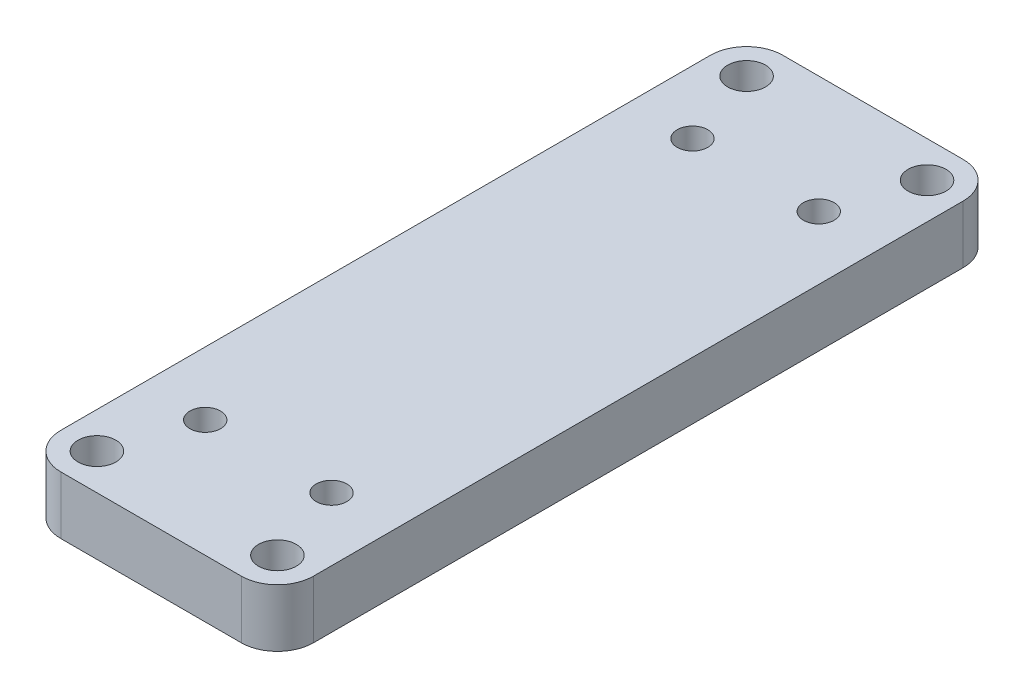
ISO-10303-21;
HEADER;
FILE_DESCRIPTION(('STEP AP214'),'2;1');
FILE_NAME('part.step','',(''),(''),'','','');
FILE_SCHEMA(('AUTOMOTIVE_DESIGN { 1 0 10303 214 1 1 1 1 }'));
ENDSEC;
DATA;
#1=APPLICATION_CONTEXT('core data for automotive mechanical design processes');
#2=APPLICATION_PROTOCOL_DEFINITION('international standard','automotive_design',2000,#1);
#3=PRODUCT_CONTEXT('',#1,'mechanical');
#4=PRODUCT('Part','Part','',(#3));
#5=PRODUCT_RELATED_PRODUCT_CATEGORY('part','',(#4));
#6=PRODUCT_DEFINITION_FORMATION('','',#4);
#7=PRODUCT_DEFINITION_CONTEXT('part definition',#1,'design');
#8=PRODUCT_DEFINITION('design','',#6,#7);
#9=PRODUCT_DEFINITION_SHAPE('','',#8);
#10=(LENGTH_UNIT() NAMED_UNIT(*) SI_UNIT(.MILLI.,.METRE.));
#11=(NAMED_UNIT(*) PLANE_ANGLE_UNIT() SI_UNIT($,.RADIAN.));
#12=(NAMED_UNIT(*) SI_UNIT($,.STERADIAN.) SOLID_ANGLE_UNIT());
#13=UNCERTAINTY_MEASURE_WITH_UNIT(LENGTH_MEASURE(1.E-05),#10,'distance_accuracy_value','');
#14=(GEOMETRIC_REPRESENTATION_CONTEXT(3) GLOBAL_UNCERTAINTY_ASSIGNED_CONTEXT((#13)) GLOBAL_UNIT_ASSIGNED_CONTEXT((#10,
#11,#12)) REPRESENTATION_CONTEXT('',''));
#15=CARTESIAN_POINT('',(0.,0.,0.));
#16=DIRECTION('',(0.,0.,1.));
#17=DIRECTION('',(1.,0.,0.));
#18=AXIS2_PLACEMENT_3D('',#15,#16,#17);
#19=CARTESIAN_POINT('',(-35.,16.,100.));
#20=DIRECTION('',(0.,1.,0.));
#21=DIRECTION('',(1.,0.,0.));
#22=AXIS2_PLACEMENT_3D('',#19,#20,#21);
#23=PLANE('',#22);
#24=CARTESIAN_POINT('',(-52.5,16.,167.5));
#25=DIRECTION('',(0.,-1.,0.));
#26=DIRECTION('',(1.,0.,0.));
#27=AXIS2_PLACEMENT_3D('',#24,#25,#26);
#28=CIRCLE('',#27,4.25);
#29=CARTESIAN_POINT('',(-56.75,16.,167.5));
#30=VERTEX_POINT('',#29);
#31=EDGE_CURVE('E40',#30,#30,#28,.T.);
#32=ORIENTED_EDGE('',*,*,#31,.T.);
#33=EDGE_LOOP('',(#32));
#34=FACE_BOUND('',#33,.T.);
#35=CARTESIAN_POINT('',(-52.5,16.,32.5));
#36=DIRECTION('',(0.,-1.,0.));
#37=DIRECTION('',(1.,0.,0.));
#38=AXIS2_PLACEMENT_3D('',#35,#36,#37);
#39=CIRCLE('',#38,4.25);
#40=CARTESIAN_POINT('',(-56.75,16.,32.5));
#41=VERTEX_POINT('',#40);
#42=EDGE_CURVE('E232',#41,#41,#39,.T.);
#43=ORIENTED_EDGE('',*,*,#42,.T.);
#44=EDGE_LOOP('',(#43));
#45=FACE_BOUND('',#44,.T.);
#46=CARTESIAN_POINT('',(-17.5,16.,32.5));
#47=DIRECTION('',(0.,-1.,0.));
#48=DIRECTION('',(1.,0.,0.));
#49=AXIS2_PLACEMENT_3D('',#46,#47,#48);
#50=CIRCLE('',#49,4.25);
#51=CARTESIAN_POINT('',(-21.75,16.,32.5));
#52=VERTEX_POINT('',#51);
#53=EDGE_CURVE('E259',#52,#52,#50,.T.);
#54=ORIENTED_EDGE('',*,*,#53,.T.);
#55=EDGE_LOOP('',(#54));
#56=FACE_BOUND('',#55,.T.);
#57=CARTESIAN_POINT('',(-17.5,16.,167.5));
#58=DIRECTION('',(0.,-1.,0.));
#59=DIRECTION('',(1.,0.,0.));
#60=AXIS2_PLACEMENT_3D('',#57,#58,#59);
#61=CIRCLE('',#60,4.25);
#62=CARTESIAN_POINT('',(-21.75,16.,167.5));
#63=VERTEX_POINT('',#62);
#64=EDGE_CURVE('E267',#63,#63,#61,.T.);
#65=ORIENTED_EDGE('',*,*,#64,.T.);
#66=EDGE_LOOP('',(#65));
#67=FACE_BOUND('',#66,.T.);
#68=CARTESIAN_POINT('',(-10.,16.,190.));
#69=DIRECTION('',(0.,-1.,0.));
#70=DIRECTION('',(1.,0.,0.));
#71=AXIS2_PLACEMENT_3D('',#68,#69,#70);
#72=CIRCLE('',#71,5.25);
#73=CARTESIAN_POINT('',(-15.25,16.,190.));
#74=VERTEX_POINT('',#73);
#75=EDGE_CURVE('E223',#74,#74,#72,.T.);
#76=ORIENTED_EDGE('',*,*,#75,.T.);
#77=EDGE_LOOP('',(#76));
#78=FACE_BOUND('',#77,.T.);
#79=CARTESIAN_POINT('',(-10.,16.,10.));
#80=DIRECTION('',(0.,-1.,0.));
#81=DIRECTION('',(1.,0.,0.));
#82=AXIS2_PLACEMENT_3D('',#79,#80,#81);
#83=CIRCLE('',#82,5.25);
#84=CARTESIAN_POINT('',(-15.25,16.,10.));
#85=VERTEX_POINT('',#84);
#86=EDGE_CURVE('E224',#85,#85,#83,.T.);
#87=ORIENTED_EDGE('',*,*,#86,.T.);
#88=EDGE_LOOP('',(#87));
#89=FACE_BOUND('',#88,.T.);
#90=CARTESIAN_POINT('',(-60.,16.,10.));
#91=DIRECTION('',(0.,-1.,0.));
#92=DIRECTION('',(1.,0.,0.));
#93=AXIS2_PLACEMENT_3D('',#90,#91,#92);
#94=CIRCLE('',#93,5.25);
#95=CARTESIAN_POINT('',(-65.25,16.,10.));
#96=VERTEX_POINT('',#95);
#97=EDGE_CURVE('E240',#96,#96,#94,.T.);
#98=ORIENTED_EDGE('',*,*,#97,.T.);
#99=EDGE_LOOP('',(#98));
#100=FACE_BOUND('',#99,.T.);
#101=CARTESIAN_POINT('',(-60.,16.,190.));
#102=DIRECTION('',(0.,-1.,0.));
#103=DIRECTION('',(1.,0.,0.));
#104=AXIS2_PLACEMENT_3D('',#101,#102,#103);
#105=CIRCLE('',#104,5.25);
#106=CARTESIAN_POINT('',(-65.25,16.,190.));
#107=VERTEX_POINT('',#106);
#108=EDGE_CURVE('E211',#107,#107,#105,.T.);
#109=ORIENTED_EDGE('',*,*,#108,.T.);
#110=EDGE_LOOP('',(#109));
#111=FACE_BOUND('',#110,.T.);
#112=CARTESIAN_POINT('',(-60.,16.,10.));
#113=DIRECTION('',(0.,-1.,0.));
#114=DIRECTION('',(-0.707106781186548,0.,-0.707106781186547));
#115=AXIS2_PLACEMENT_3D('',#112,#113,#114);
#116=CIRCLE('',#115,10.);
#117=CARTESIAN_POINT('',(-70.,16.,10.));
#118=VERTEX_POINT('',#117);
#119=CARTESIAN_POINT('',(-60.,16.,0.));
#120=VERTEX_POINT('',#119);
#121=EDGE_CURVE('E190',#118,#120,#116,.T.);
#122=ORIENTED_EDGE('',*,*,#121,.F.);
#123=DIRECTION('',(0.,0.,1.));
#124=VECTOR('',#123,1.);
#125=CARTESIAN_POINT('',(-70.,16.,0.));
#126=LINE('',#125,#124);
#127=CARTESIAN_POINT('',(-70.,16.,190.));
#128=VERTEX_POINT('',#127);
#129=EDGE_CURVE('E175',#118,#128,#126,.T.);
#130=ORIENTED_EDGE('',*,*,#129,.T.);
#131=CARTESIAN_POINT('',(-60.,16.,190.));
#132=DIRECTION('',(0.,-1.,0.));
#133=DIRECTION('',(-0.707106781186548,0.,0.707106781186548));
#134=AXIS2_PLACEMENT_3D('',#131,#132,#133);
#135=CIRCLE('',#134,10.);
#136=CARTESIAN_POINT('',(-60.,16.,200.));
#137=VERTEX_POINT('',#136);
#138=EDGE_CURVE('E199',#137,#128,#135,.T.);
#139=ORIENTED_EDGE('',*,*,#138,.F.);
#140=DIRECTION('',(1.,0.,0.));
#141=VECTOR('',#140,1.);
#142=CARTESIAN_POINT('',(-70.,16.,200.));
#143=LINE('',#142,#141);
#144=CARTESIAN_POINT('',(-10.,16.,200.));
#145=VERTEX_POINT('',#144);
#146=EDGE_CURVE('E28',#137,#145,#143,.T.);
#147=ORIENTED_EDGE('',*,*,#146,.T.);
#148=CARTESIAN_POINT('',(-10.,16.,190.));
#149=DIRECTION('',(0.,-1.,0.));
#150=DIRECTION('',(0.707106781186548,0.,0.707106781186547));
#151=AXIS2_PLACEMENT_3D('',#148,#149,#150);
#152=CIRCLE('',#151,10.);
#153=CARTESIAN_POINT('',(0.,16.,190.));
#154=VERTEX_POINT('',#153);
#155=EDGE_CURVE('E200',#154,#145,#152,.T.);
#156=ORIENTED_EDGE('',*,*,#155,.F.);
#157=DIRECTION('',(0.,0.,-1.));
#158=VECTOR('',#157,1.);
#159=CARTESIAN_POINT('',(0.,16.,200.));
#160=LINE('',#159,#158);
#161=CARTESIAN_POINT('',(0.,16.,10.));
#162=VERTEX_POINT('',#161);
#163=EDGE_CURVE('E284',#154,#162,#160,.T.);
#164=ORIENTED_EDGE('',*,*,#163,.T.);
#165=CARTESIAN_POINT('',(-10.,16.,10.));
#166=DIRECTION('',(0.,-1.,0.));
#167=DIRECTION('',(0.707106781186547,0.,-0.707106781186548));
#168=AXIS2_PLACEMENT_3D('',#165,#166,#167);
#169=CIRCLE('',#168,10.);
#170=CARTESIAN_POINT('',(-10.,16.,0.));
#171=VERTEX_POINT('',#170);
#172=EDGE_CURVE('E246',#171,#162,#169,.T.);
#173=ORIENTED_EDGE('',*,*,#172,.F.);
#174=DIRECTION('',(-1.,0.,0.));
#175=VECTOR('',#174,1.);
#176=CARTESIAN_POINT('',(0.,16.,0.));
#177=LINE('',#176,#175);
#178=EDGE_CURVE('E11',#171,#120,#177,.T.);
#179=ORIENTED_EDGE('',*,*,#178,.T.);
#180=EDGE_LOOP('',(#122,#130,#139,#147,#156,#164,#173,#179));
#181=FACE_BOUND('',#180,.T.);
#182=ADVANCED_FACE('F17',(#34,#45,#56,#67,#78,#89,#100,#111,#181),#23,.T.);
#183=CARTESIAN_POINT('',(0.,0.,0.));
#184=DIRECTION('',(0.,0.,-1.));
#185=DIRECTION('',(-1.,0.,0.));
#186=AXIS2_PLACEMENT_3D('',#183,#184,#185);
#187=PLANE('',#186);
#188=DIRECTION('',(0.,-1.,0.));
#189=VECTOR('',#188,1.);
#190=CARTESIAN_POINT('',(-60.,0.,0.));
#191=LINE('',#190,#189);
#192=CARTESIAN_POINT('',(-60.,0.,0.));
#193=VERTEX_POINT('',#192);
#194=EDGE_CURVE('E183',#120,#193,#191,.T.);
#195=ORIENTED_EDGE('',*,*,#194,.F.);
#196=ORIENTED_EDGE('',*,*,#178,.F.);
#197=DIRECTION('',(0.,1.,0.));
#198=VECTOR('',#197,1.);
#199=CARTESIAN_POINT('',(-10.,0.,0.));
#200=LINE('',#199,#198);
#201=CARTESIAN_POINT('',(-10.,0.,0.));
#202=VERTEX_POINT('',#201);
#203=EDGE_CURVE('E288',#202,#171,#200,.T.);
#204=ORIENTED_EDGE('',*,*,#203,.F.);
#205=DIRECTION('',(-1.,0.,0.));
#206=VECTOR('',#205,1.);
#207=CARTESIAN_POINT('',(0.,0.,0.));
#208=LINE('',#207,#206);
#209=EDGE_CURVE('E218',#202,#193,#208,.T.);
#210=ORIENTED_EDGE('',*,*,#209,.T.);
#211=EDGE_LOOP('',(#195,#196,#204,#210));
#212=FACE_BOUND('',#211,.T.);
#213=ADVANCED_FACE('F330',(#212),#187,.T.);
#214=CARTESIAN_POINT('',(-70.,0.,200.));
#215=DIRECTION('',(0.,0.,1.));
#216=DIRECTION('',(1.,0.,0.));
#217=AXIS2_PLACEMENT_3D('',#214,#215,#216);
#218=PLANE('',#217);
#219=DIRECTION('',(0.,-1.,0.));
#220=VECTOR('',#219,1.);
#221=CARTESIAN_POINT('',(-10.,0.,200.));
#222=LINE('',#221,#220);
#223=CARTESIAN_POINT('',(-10.,0.,200.));
#224=VERTEX_POINT('',#223);
#225=EDGE_CURVE('E196',#145,#224,#222,.T.);
#226=ORIENTED_EDGE('',*,*,#225,.F.);
#227=ORIENTED_EDGE('',*,*,#146,.F.);
#228=DIRECTION('',(0.,1.,0.));
#229=VECTOR('',#228,1.);
#230=CARTESIAN_POINT('',(-60.,0.,200.));
#231=LINE('',#230,#229);
#232=CARTESIAN_POINT('',(-60.,0.,200.));
#233=VERTEX_POINT('',#232);
#234=EDGE_CURVE('E212',#233,#137,#231,.T.);
#235=ORIENTED_EDGE('',*,*,#234,.F.);
#236=DIRECTION('',(1.,0.,0.));
#237=VECTOR('',#236,1.);
#238=CARTESIAN_POINT('',(-70.,0.,200.));
#239=LINE('',#238,#237);
#240=EDGE_CURVE('E624',#233,#224,#239,.T.);
#241=ORIENTED_EDGE('',*,*,#240,.T.);
#242=EDGE_LOOP('',(#226,#227,#235,#241));
#243=FACE_BOUND('',#242,.T.);
#244=ADVANCED_FACE('F19',(#243),#218,.T.);
#245=CARTESIAN_POINT('',(-52.5,0.,167.5));
#246=DIRECTION('',(0.,1.,0.));
#247=DIRECTION('',(1.,0.,0.));
#248=AXIS2_PLACEMENT_3D('',#245,#246,#247);
#249=CYLINDRICAL_SURFACE('',#248,4.25);
#250=CARTESIAN_POINT('',(-52.5,0.,167.5));
#251=DIRECTION('',(0.,1.,0.));
#252=DIRECTION('',(1.,0.,0.));
#253=AXIS2_PLACEMENT_3D('',#250,#251,#252);
#254=CIRCLE('',#253,4.25);
#255=CARTESIAN_POINT('',(-56.75,0.,167.5));
#256=VERTEX_POINT('',#255);
#257=EDGE_CURVE('E205',#256,#256,#254,.T.);
#258=ORIENTED_EDGE('',*,*,#257,.F.);
#259=DIRECTION('',(0.,1.,0.));
#260=VECTOR('',#259,1.);
#261=CARTESIAN_POINT('',(-56.75,0.,167.5));
#262=LINE('',#261,#260);
#263=EDGE_CURVE('E21',#256,#30,#262,.T.);
#264=ORIENTED_EDGE('',*,*,#263,.T.);
#265=ORIENTED_EDGE('',*,*,#31,.F.);
#266=ORIENTED_EDGE('',*,*,#263,.F.);
#267=EDGE_LOOP('',(#258,#264,#265,#266));
#268=FACE_BOUND('',#267,.T.);
#269=ADVANCED_FACE('F347',(#268),#249,.F.);
#270=CARTESIAN_POINT('',(-52.5,0.,32.5));
#271=DIRECTION('',(0.,1.,0.));
#272=DIRECTION('',(1.,0.,0.));
#273=AXIS2_PLACEMENT_3D('',#270,#271,#272);
#274=CYLINDRICAL_SURFACE('',#273,4.25);
#275=CARTESIAN_POINT('',(-52.5,0.,32.5));
#276=DIRECTION('',(0.,1.,0.));
#277=DIRECTION('',(1.,0.,0.));
#278=AXIS2_PLACEMENT_3D('',#275,#276,#277);
#279=CIRCLE('',#278,4.25);
#280=CARTESIAN_POINT('',(-56.75,0.,32.5));
#281=VERTEX_POINT('',#280);
#282=EDGE_CURVE('E201',#281,#281,#279,.T.);
#283=ORIENTED_EDGE('',*,*,#282,.F.);
#284=DIRECTION('',(0.,1.,0.));
#285=VECTOR('',#284,1.);
#286=CARTESIAN_POINT('',(-56.75,0.,32.5));
#287=LINE('',#286,#285);
#288=EDGE_CURVE('E235',#281,#41,#287,.T.);
#289=ORIENTED_EDGE('',*,*,#288,.T.);
#290=ORIENTED_EDGE('',*,*,#42,.F.);
#291=ORIENTED_EDGE('',*,*,#288,.F.);
#292=EDGE_LOOP('',(#283,#289,#290,#291));
#293=FACE_BOUND('',#292,.T.);
#294=ADVANCED_FACE('F400',(#293),#274,.F.);
#295=CARTESIAN_POINT('',(-17.5,0.,32.5));
#296=DIRECTION('',(0.,1.,0.));
#297=DIRECTION('',(1.,0.,0.));
#298=AXIS2_PLACEMENT_3D('',#295,#296,#297);
#299=CYLINDRICAL_SURFACE('',#298,4.25);
#300=CARTESIAN_POINT('',(-17.5,0.,32.5));
#301=DIRECTION('',(0.,1.,0.));
#302=DIRECTION('',(1.,0.,0.));
#303=AXIS2_PLACEMENT_3D('',#300,#301,#302);
#304=CIRCLE('',#303,4.25);
#305=CARTESIAN_POINT('',(-21.75,0.,32.5));
#306=VERTEX_POINT('',#305);
#307=EDGE_CURVE('E206',#306,#306,#304,.T.);
#308=ORIENTED_EDGE('',*,*,#307,.F.);
#309=DIRECTION('',(0.,1.,0.));
#310=VECTOR('',#309,1.);
#311=CARTESIAN_POINT('',(-21.75,0.,32.5));
#312=LINE('',#311,#310);
#313=EDGE_CURVE('E270',#306,#52,#312,.T.);
#314=ORIENTED_EDGE('',*,*,#313,.T.);
#315=ORIENTED_EDGE('',*,*,#53,.F.);
#316=ORIENTED_EDGE('',*,*,#313,.F.);
#317=EDGE_LOOP('',(#308,#314,#315,#316));
#318=FACE_BOUND('',#317,.T.);
#319=ADVANCED_FACE('F313',(#318),#299,.F.);
#320=CARTESIAN_POINT('',(-17.5,0.,167.5));
#321=DIRECTION('',(0.,1.,0.));
#322=DIRECTION('',(1.,0.,0.));
#323=AXIS2_PLACEMENT_3D('',#320,#321,#322);
#324=CYLINDRICAL_SURFACE('',#323,4.25);
#325=CARTESIAN_POINT('',(-17.5,0.,167.5));
#326=DIRECTION('',(0.,1.,0.));
#327=DIRECTION('',(1.,0.,0.));
#328=AXIS2_PLACEMENT_3D('',#325,#326,#327);
#329=CIRCLE('',#328,4.25);
#330=CARTESIAN_POINT('',(-21.75,0.,167.5));
#331=VERTEX_POINT('',#330);
#332=EDGE_CURVE('E274',#331,#331,#329,.T.);
#333=ORIENTED_EDGE('',*,*,#332,.F.);
#334=DIRECTION('',(0.,1.,0.));
#335=VECTOR('',#334,1.);
#336=CARTESIAN_POINT('',(-21.75,0.,167.5));
#337=LINE('',#336,#335);
#338=EDGE_CURVE('E227',#331,#63,#337,.T.);
#339=ORIENTED_EDGE('',*,*,#338,.T.);
#340=ORIENTED_EDGE('',*,*,#64,.F.);
#341=ORIENTED_EDGE('',*,*,#338,.F.);
#342=EDGE_LOOP('',(#333,#339,#340,#341));
#343=FACE_BOUND('',#342,.T.);
#344=ADVANCED_FACE('F359',(#343),#324,.F.);
#345=CARTESIAN_POINT('',(-10.,0.,190.));
#346=DIRECTION('',(0.,1.,0.));
#347=DIRECTION('',(1.,0.,0.));
#348=AXIS2_PLACEMENT_3D('',#345,#346,#347);
#349=CYLINDRICAL_SURFACE('',#348,5.25);
#350=CARTESIAN_POINT('',(-10.,0.,190.));
#351=DIRECTION('',(0.,1.,0.));
#352=DIRECTION('',(1.,0.,0.));
#353=AXIS2_PLACEMENT_3D('',#350,#351,#352);
#354=CIRCLE('',#353,5.25);
#355=CARTESIAN_POINT('',(-15.25,0.,190.));
#356=VERTEX_POINT('',#355);
#357=EDGE_CURVE('E278',#356,#356,#354,.T.);
#358=ORIENTED_EDGE('',*,*,#357,.F.);
#359=DIRECTION('',(0.,1.,0.));
#360=VECTOR('',#359,1.);
#361=CARTESIAN_POINT('',(-15.25,0.,190.));
#362=LINE('',#361,#360);
#363=EDGE_CURVE('E219',#356,#74,#362,.T.);
#364=ORIENTED_EDGE('',*,*,#363,.T.);
#365=ORIENTED_EDGE('',*,*,#75,.F.);
#366=ORIENTED_EDGE('',*,*,#363,.F.);
#367=EDGE_LOOP('',(#358,#364,#365,#366));
#368=FACE_BOUND('',#367,.T.);
#369=ADVANCED_FACE('F353',(#368),#349,.F.);
#370=CARTESIAN_POINT('',(-10.,0.,10.));
#371=DIRECTION('',(0.,1.,0.));
#372=DIRECTION('',(1.,0.,0.));
#373=AXIS2_PLACEMENT_3D('',#370,#371,#372);
#374=CYLINDRICAL_SURFACE('',#373,5.25);
#375=CARTESIAN_POINT('',(-10.,0.,10.));
#376=DIRECTION('',(0.,1.,0.));
#377=DIRECTION('',(1.,0.,0.));
#378=AXIS2_PLACEMENT_3D('',#375,#376,#377);
#379=CIRCLE('',#378,5.25);
#380=CARTESIAN_POINT('',(-15.25,0.,10.));
#381=VERTEX_POINT('',#380);
#382=EDGE_CURVE('E193',#381,#381,#379,.T.);
#383=ORIENTED_EDGE('',*,*,#382,.F.);
#384=DIRECTION('',(0.,1.,0.));
#385=VECTOR('',#384,1.);
#386=CARTESIAN_POINT('',(-15.25,0.,10.));
#387=LINE('',#386,#385);
#388=EDGE_CURVE('E236',#381,#85,#387,.T.);
#389=ORIENTED_EDGE('',*,*,#388,.T.);
#390=ORIENTED_EDGE('',*,*,#86,.F.);
#391=ORIENTED_EDGE('',*,*,#388,.F.);
#392=EDGE_LOOP('',(#383,#389,#390,#391));
#393=FACE_BOUND('',#392,.T.);
#394=ADVANCED_FACE('F358',(#393),#374,.F.);
#395=CARTESIAN_POINT('',(-60.,0.,10.));
#396=DIRECTION('',(0.,1.,0.));
#397=DIRECTION('',(1.,0.,0.));
#398=AXIS2_PLACEMENT_3D('',#395,#396,#397);
#399=CYLINDRICAL_SURFACE('',#398,5.25);
#400=CARTESIAN_POINT('',(-60.,0.,10.));
#401=DIRECTION('',(0.,1.,0.));
#402=DIRECTION('',(1.,0.,0.));
#403=AXIS2_PLACEMENT_3D('',#400,#401,#402);
#404=CIRCLE('',#403,5.25);
#405=CARTESIAN_POINT('',(-65.25,0.,10.));
#406=VERTEX_POINT('',#405);
#407=EDGE_CURVE('E266',#406,#406,#404,.T.);
#408=ORIENTED_EDGE('',*,*,#407,.F.);
#409=DIRECTION('',(0.,1.,0.));
#410=VECTOR('',#409,1.);
#411=CARTESIAN_POINT('',(-65.25,0.,10.));
#412=LINE('',#411,#410);
#413=EDGE_CURVE('E300',#406,#96,#412,.T.);
#414=ORIENTED_EDGE('',*,*,#413,.T.);
#415=ORIENTED_EDGE('',*,*,#97,.F.);
#416=ORIENTED_EDGE('',*,*,#413,.F.);
#417=EDGE_LOOP('',(#408,#414,#415,#416));
#418=FACE_BOUND('',#417,.T.);
#419=ADVANCED_FACE('F371',(#418),#399,.F.);
#420=CARTESIAN_POINT('',(-60.,0.,190.));
#421=DIRECTION('',(0.,1.,0.));
#422=DIRECTION('',(1.,0.,0.));
#423=AXIS2_PLACEMENT_3D('',#420,#421,#422);
#424=CYLINDRICAL_SURFACE('',#423,5.25);
#425=CARTESIAN_POINT('',(-60.,0.,190.));
#426=DIRECTION('',(0.,1.,0.));
#427=DIRECTION('',(1.,0.,0.));
#428=AXIS2_PLACEMENT_3D('',#425,#426,#427);
#429=CIRCLE('',#428,5.25);
#430=CARTESIAN_POINT('',(-65.25,0.,190.));
#431=VERTEX_POINT('',#430);
#432=EDGE_CURVE('E262',#431,#431,#429,.T.);
#433=ORIENTED_EDGE('',*,*,#432,.F.);
#434=DIRECTION('',(0.,1.,0.));
#435=VECTOR('',#434,1.);
#436=CARTESIAN_POINT('',(-65.25,0.,190.));
#437=LINE('',#436,#435);
#438=EDGE_CURVE('E207',#431,#107,#437,.T.);
#439=ORIENTED_EDGE('',*,*,#438,.T.);
#440=ORIENTED_EDGE('',*,*,#108,.F.);
#441=ORIENTED_EDGE('',*,*,#438,.F.);
#442=EDGE_LOOP('',(#433,#439,#440,#441));
#443=FACE_BOUND('',#442,.T.);
#444=ADVANCED_FACE('F365',(#443),#424,.F.);
#445=CARTESIAN_POINT('',(-60.,0.,190.));
#446=DIRECTION('',(0.,1.,0.));
#447=DIRECTION('',(-0.707106781186548,0.,0.707106781186548));
#448=AXIS2_PLACEMENT_3D('',#445,#446,#447);
#449=CYLINDRICAL_SURFACE('',#448,10.);
#450=ORIENTED_EDGE('',*,*,#138,.T.);
#451=DIRECTION('',(0.,-1.,0.));
#452=VECTOR('',#451,1.);
#453=CARTESIAN_POINT('',(-70.,0.,190.));
#454=LINE('',#453,#452);
#455=CARTESIAN_POINT('',(-70.,0.,190.));
#456=VERTEX_POINT('',#455);
#457=EDGE_CURVE('E169',#128,#456,#454,.T.);
#458=ORIENTED_EDGE('',*,*,#457,.T.);
#459=CARTESIAN_POINT('',(-60.,0.,190.));
#460=DIRECTION('',(0.,1.,0.));
#461=DIRECTION('',(-0.707106781186548,0.,0.707106781186548));
#462=AXIS2_PLACEMENT_3D('',#459,#460,#461);
#463=CIRCLE('',#462,10.);
#464=EDGE_CURVE('E164',#456,#233,#463,.T.);
#465=ORIENTED_EDGE('',*,*,#464,.T.);
#466=ORIENTED_EDGE('',*,*,#234,.T.);
#467=EDGE_LOOP('',(#450,#458,#465,#466));
#468=FACE_BOUND('',#467,.T.);
#469=ADVANCED_FACE('F370',(#468),#449,.T.);
#470=CARTESIAN_POINT('',(-10.,0.,190.));
#471=DIRECTION('',(0.,1.,0.));
#472=DIRECTION('',(0.707106781186548,0.,0.707106781186547));
#473=AXIS2_PLACEMENT_3D('',#470,#471,#472);
#474=CYLINDRICAL_SURFACE('',#473,10.);
#475=ORIENTED_EDGE('',*,*,#155,.T.);
#476=ORIENTED_EDGE('',*,*,#225,.T.);
#477=CARTESIAN_POINT('',(-10.,0.,190.));
#478=DIRECTION('',(0.,1.,0.));
#479=DIRECTION('',(0.707106781186548,0.,0.707106781186547));
#480=AXIS2_PLACEMENT_3D('',#477,#478,#479);
#481=CIRCLE('',#480,10.);
#482=CARTESIAN_POINT('',(0.,0.,190.));
#483=VERTEX_POINT('',#482);
#484=EDGE_CURVE('E252',#224,#483,#481,.T.);
#485=ORIENTED_EDGE('',*,*,#484,.T.);
#486=DIRECTION('',(0.,1.,0.));
#487=VECTOR('',#486,1.);
#488=CARTESIAN_POINT('',(0.,0.,190.));
#489=LINE('',#488,#487);
#490=EDGE_CURVE('E231',#483,#154,#489,.T.);
#491=ORIENTED_EDGE('',*,*,#490,.T.);
#492=EDGE_LOOP('',(#475,#476,#485,#491));
#493=FACE_BOUND('',#492,.T.);
#494=ADVANCED_FACE('F390',(#493),#474,.T.);
#495=CARTESIAN_POINT('',(0.,0.,200.));
#496=DIRECTION('',(1.,0.,0.));
#497=DIRECTION('',(0.,0.,-1.));
#498=AXIS2_PLACEMENT_3D('',#495,#496,#497);
#499=PLANE('',#498);
#500=DIRECTION('',(0.,-1.,0.));
#501=VECTOR('',#500,1.);
#502=CARTESIAN_POINT('',(0.,0.,10.));
#503=LINE('',#502,#501);
#504=CARTESIAN_POINT('',(0.,0.,10.));
#505=VERTEX_POINT('',#504);
#506=EDGE_CURVE('E285',#162,#505,#503,.T.);
#507=ORIENTED_EDGE('',*,*,#506,.F.);
#508=ORIENTED_EDGE('',*,*,#163,.F.);
#509=ORIENTED_EDGE('',*,*,#490,.F.);
#510=DIRECTION('',(0.,0.,-1.));
#511=VECTOR('',#510,1.);
#512=CARTESIAN_POINT('',(0.,0.,200.));
#513=LINE('',#512,#511);
#514=EDGE_CURVE('E217',#483,#505,#513,.T.);
#515=ORIENTED_EDGE('',*,*,#514,.T.);
#516=EDGE_LOOP('',(#507,#508,#509,#515));
#517=FACE_BOUND('',#516,.T.);
#518=ADVANCED_FACE('F411',(#517),#499,.T.);
#519=CARTESIAN_POINT('',(-10.,0.,10.));
#520=DIRECTION('',(0.,1.,0.));
#521=DIRECTION('',(0.707106781186547,0.,-0.707106781186548));
#522=AXIS2_PLACEMENT_3D('',#519,#520,#521);
#523=CYLINDRICAL_SURFACE('',#522,10.);
#524=ORIENTED_EDGE('',*,*,#172,.T.);
#525=ORIENTED_EDGE('',*,*,#506,.T.);
#526=CARTESIAN_POINT('',(-10.,0.,10.));
#527=DIRECTION('',(0.,1.,0.));
#528=DIRECTION('',(0.707106781186547,0.,-0.707106781186548));
#529=AXIS2_PLACEMENT_3D('',#526,#527,#528);
#530=CIRCLE('',#529,10.);
#531=EDGE_CURVE('E213',#505,#202,#530,.T.);
#532=ORIENTED_EDGE('',*,*,#531,.T.);
#533=ORIENTED_EDGE('',*,*,#203,.T.);
#534=EDGE_LOOP('',(#524,#525,#532,#533));
#535=FACE_BOUND('',#534,.T.);
#536=ADVANCED_FACE('F416',(#535),#523,.T.);
#537=CARTESIAN_POINT('',(-35.,0.,100.));
#538=DIRECTION('',(0.,-1.,0.));
#539=DIRECTION('',(0.,0.,-1.));
#540=AXIS2_PLACEMENT_3D('',#537,#538,#539);
#541=PLANE('',#540);
#542=ORIENTED_EDGE('',*,*,#257,.T.);
#543=EDGE_LOOP('',(#542));
#544=FACE_BOUND('',#543,.T.);
#545=ORIENTED_EDGE('',*,*,#282,.T.);
#546=EDGE_LOOP('',(#545));
#547=FACE_BOUND('',#546,.T.);
#548=ORIENTED_EDGE('',*,*,#307,.T.);
#549=EDGE_LOOP('',(#548));
#550=FACE_BOUND('',#549,.T.);
#551=ORIENTED_EDGE('',*,*,#332,.T.);
#552=EDGE_LOOP('',(#551));
#553=FACE_BOUND('',#552,.T.);
#554=ORIENTED_EDGE('',*,*,#357,.T.);
#555=EDGE_LOOP('',(#554));
#556=FACE_BOUND('',#555,.T.);
#557=ORIENTED_EDGE('',*,*,#382,.T.);
#558=EDGE_LOOP('',(#557));
#559=FACE_BOUND('',#558,.T.);
#560=ORIENTED_EDGE('',*,*,#407,.T.);
#561=EDGE_LOOP('',(#560));
#562=FACE_BOUND('',#561,.T.);
#563=ORIENTED_EDGE('',*,*,#432,.T.);
#564=EDGE_LOOP('',(#563));
#565=FACE_BOUND('',#564,.T.);
#566=CARTESIAN_POINT('',(-60.,0.,10.));
#567=DIRECTION('',(0.,1.,0.));
#568=DIRECTION('',(-0.707106781186548,0.,-0.707106781186547));
#569=AXIS2_PLACEMENT_3D('',#566,#567,#568);
#570=CIRCLE('',#569,10.);
#571=CARTESIAN_POINT('',(-70.,0.,10.));
#572=VERTEX_POINT('',#571);
#573=EDGE_CURVE('E160',#193,#572,#570,.T.);
#574=ORIENTED_EDGE('',*,*,#573,.F.);
#575=ORIENTED_EDGE('',*,*,#209,.F.);
#576=ORIENTED_EDGE('',*,*,#531,.F.);
#577=ORIENTED_EDGE('',*,*,#514,.F.);
#578=ORIENTED_EDGE('',*,*,#484,.F.);
#579=ORIENTED_EDGE('',*,*,#240,.F.);
#580=ORIENTED_EDGE('',*,*,#464,.F.);
#581=DIRECTION('',(0.,0.,1.));
#582=VECTOR('',#581,1.);
#583=CARTESIAN_POINT('',(-70.,0.,0.));
#584=LINE('',#583,#582);
#585=EDGE_CURVE('E155',#572,#456,#584,.T.);
#586=ORIENTED_EDGE('',*,*,#585,.F.);
#587=EDGE_LOOP('',(#574,#575,#576,#577,#578,#579,#580,#586));
#588=FACE_BOUND('',#587,.T.);
#589=ADVANCED_FACE('F157',(#544,#547,#550,#553,#556,#559,#562,#565,#588),#541,.T.);
#590=CARTESIAN_POINT('',(-70.,0.,0.));
#591=DIRECTION('',(-1.,0.,0.));
#592=DIRECTION('',(0.,1.,0.));
#593=AXIS2_PLACEMENT_3D('',#590,#591,#592);
#594=PLANE('',#593);
#595=DIRECTION('',(0.,1.,0.));
#596=VECTOR('',#595,1.);
#597=CARTESIAN_POINT('',(-70.,0.,10.));
#598=LINE('',#597,#596);
#599=EDGE_CURVE('E170',#572,#118,#598,.T.);
#600=ORIENTED_EDGE('',*,*,#599,.F.);
#601=ORIENTED_EDGE('',*,*,#585,.T.);
#602=ORIENTED_EDGE('',*,*,#457,.F.);
#603=ORIENTED_EDGE('',*,*,#129,.F.);
#604=EDGE_LOOP('',(#600,#601,#602,#603));
#605=FACE_BOUND('',#604,.T.);
#606=ADVANCED_FACE('F173',(#605),#594,.T.);
#607=CARTESIAN_POINT('',(-60.,0.,10.));
#608=DIRECTION('',(0.,1.,0.));
#609=DIRECTION('',(-0.707106781186548,0.,-0.707106781186547));
#610=AXIS2_PLACEMENT_3D('',#607,#608,#609);
#611=CYLINDRICAL_SURFACE('',#610,10.);
#612=ORIENTED_EDGE('',*,*,#121,.T.);
#613=ORIENTED_EDGE('',*,*,#194,.T.);
#614=ORIENTED_EDGE('',*,*,#573,.T.);
#615=ORIENTED_EDGE('',*,*,#599,.T.);
#616=EDGE_LOOP('',(#612,#613,#614,#615));
#617=FACE_BOUND('',#616,.T.);
#618=ADVANCED_FACE('F181',(#617),#611,.T.);
#619=CLOSED_SHELL('',(#182,#213,#244,#269,#294,#319,#344,#369,#394,#419,#444,#469,#494,#518,
#536,#589,#606,#618));
#620=MANIFOLD_SOLID_BREP('B1',#619);
#621=ADVANCED_BREP_SHAPE_REPRESENTATION('',(#18,#620),#14);
#622=SHAPE_DEFINITION_REPRESENTATION(#9,#621);
ENDSEC;
END-ISO-10303-21;
